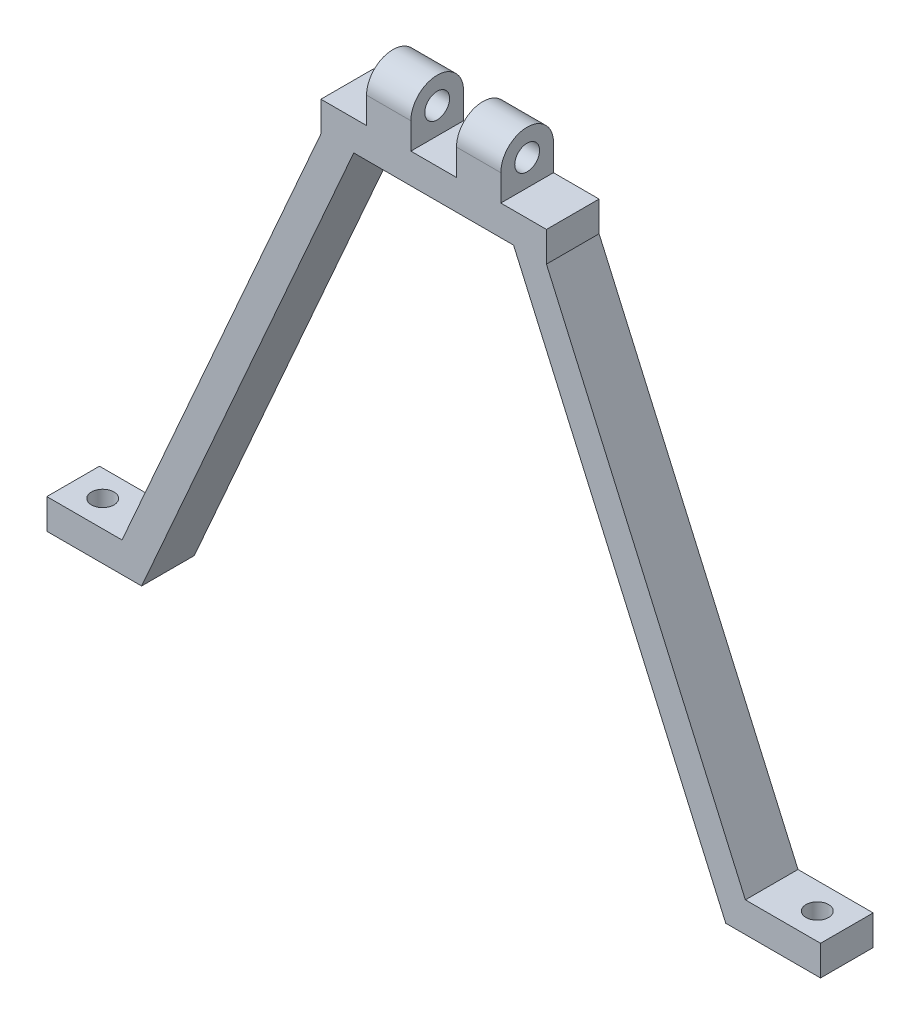
ISO-10303-21;
HEADER;
FILE_DESCRIPTION(('STEP AP214'),'2;1');
FILE_NAME('part.step','',(''),(''),'','','');
FILE_SCHEMA(('AUTOMOTIVE_DESIGN { 1 0 10303 214 1 1 1 1 }'));
ENDSEC;
DATA;
#1=APPLICATION_CONTEXT('core data for automotive mechanical design processes');
#2=APPLICATION_PROTOCOL_DEFINITION('international standard','automotive_design',2000,#1);
#3=PRODUCT_CONTEXT('',#1,'mechanical');
#4=PRODUCT('Part','Part','',(#3));
#5=PRODUCT_RELATED_PRODUCT_CATEGORY('part','',(#4));
#6=PRODUCT_DEFINITION_FORMATION('','',#4);
#7=PRODUCT_DEFINITION_CONTEXT('part definition',#1,'design');
#8=PRODUCT_DEFINITION('design','',#6,#7);
#9=PRODUCT_DEFINITION_SHAPE('','',#8);
#10=(LENGTH_UNIT() NAMED_UNIT(*) SI_UNIT(.MILLI.,.METRE.));
#11=(NAMED_UNIT(*) PLANE_ANGLE_UNIT() SI_UNIT($,.RADIAN.));
#12=(NAMED_UNIT(*) SI_UNIT($,.STERADIAN.) SOLID_ANGLE_UNIT());
#13=UNCERTAINTY_MEASURE_WITH_UNIT(LENGTH_MEASURE(1.E-05),#10,'distance_accuracy_value','');
#14=(GEOMETRIC_REPRESENTATION_CONTEXT(3) GLOBAL_UNCERTAINTY_ASSIGNED_CONTEXT((#13)) GLOBAL_UNIT_ASSIGNED_CONTEXT((#10,
#11,#12)) REPRESENTATION_CONTEXT('',''));
#15=CARTESIAN_POINT('',(0.,0.,0.));
#16=DIRECTION('',(0.,0.,1.));
#17=DIRECTION('',(1.,0.,0.));
#18=AXIS2_PLACEMENT_3D('',#15,#16,#17);
#19=CARTESIAN_POINT('',(0.,0.,7.));
#20=DIRECTION('',(0.,-1.,0.));
#21=DIRECTION('',(1.,0.,0.));
#22=AXIS2_PLACEMENT_3D('',#19,#20,#21);
#23=PLANE('',#22);
#24=DIRECTION('',(0.,0.,1.));
#25=VECTOR('',#24,1.);
#26=CARTESIAN_POINT('',(15.,0.,0.));
#27=LINE('',#26,#25);
#28=CARTESIAN_POINT('',(15.,0.,0.));
#29=VERTEX_POINT('',#28);
#30=CARTESIAN_POINT('',(15.,0.,7.));
#31=VERTEX_POINT('',#30);
#32=EDGE_CURVE('E388',#29,#31,#27,.T.);
#33=ORIENTED_EDGE('',*,*,#32,.F.);
#34=DIRECTION('',(-1.,0.,0.));
#35=VECTOR('',#34,1.);
#36=CARTESIAN_POINT('',(0.,0.,0.));
#37=LINE('',#36,#35);
#38=CARTESIAN_POINT('',(8.93,0.,0.));
#39=VERTEX_POINT('',#38);
#40=EDGE_CURVE('E212',#29,#39,#37,.T.);
#41=ORIENTED_EDGE('',*,*,#40,.T.);
#42=DIRECTION('',(0.,0.,1.));
#43=VECTOR('',#42,1.);
#44=CARTESIAN_POINT('',(8.93,0.,0.));
#45=LINE('',#44,#43);
#46=CARTESIAN_POINT('',(8.93,0.,7.));
#47=VERTEX_POINT('',#46);
#48=EDGE_CURVE('E375',#39,#47,#45,.T.);
#49=ORIENTED_EDGE('',*,*,#48,.T.);
#50=DIRECTION('',(-1.,0.,0.));
#51=VECTOR('',#50,1.);
#52=CARTESIAN_POINT('',(0.,0.,7.));
#53=LINE('',#52,#51);
#54=EDGE_CURVE('E306',#31,#47,#53,.T.);
#55=ORIENTED_EDGE('',*,*,#54,.F.);
#56=EDGE_LOOP('',(#33,#41,#49,#55));
#57=FACE_BOUND('',#56,.T.);
#58=ADVANCED_FACE('F41',(#57),#23,.F.);
#59=CARTESIAN_POINT('',(15.,3.50000000000002,3.5));
#60=DIRECTION('',(-1.,0.,0.));
#61=DIRECTION('',(0.,0.,1.));
#62=AXIS2_PLACEMENT_3D('',#59,#60,#61);
#63=CYLINDRICAL_SURFACE('',#62,3.5);
#64=DIRECTION('',(-1.,0.,0.));
#65=VECTOR('',#64,1.);
#66=CARTESIAN_POINT('',(15.,3.50000000000002,0.));
#67=LINE('',#66,#65);
#68=CARTESIAN_POINT('',(-3.035,3.50000000000002,0.));
#69=VERTEX_POINT('',#68);
#70=CARTESIAN_POINT('',(-8.93,3.50000000000002,0.));
#71=VERTEX_POINT('',#70);
#72=EDGE_CURVE('E267',#69,#71,#67,.T.);
#73=ORIENTED_EDGE('',*,*,#72,.T.);
#74=CARTESIAN_POINT('',(-8.93,3.50000000000002,3.5));
#75=DIRECTION('',(1.,0.,0.));
#76=DIRECTION('',(0.,0.,-1.));
#77=AXIS2_PLACEMENT_3D('',#74,#75,#76);
#78=CIRCLE('',#77,3.5);
#79=CARTESIAN_POINT('',(-8.93,3.50000000000002,7.));
#80=VERTEX_POINT('',#79);
#81=EDGE_CURVE('E270',#71,#80,#78,.T.);
#82=ORIENTED_EDGE('',*,*,#81,.T.);
#83=DIRECTION('',(-1.,0.,0.));
#84=VECTOR('',#83,1.);
#85=CARTESIAN_POINT('',(15.,3.50000000000002,7.));
#86=LINE('',#85,#84);
#87=CARTESIAN_POINT('',(-3.035,3.50000000000002,7.));
#88=VERTEX_POINT('',#87);
#89=EDGE_CURVE('E272',#88,#80,#86,.T.);
#90=ORIENTED_EDGE('',*,*,#89,.F.);
#91=CARTESIAN_POINT('',(-3.035,3.50000000000002,3.5));
#92=DIRECTION('',(-1.,0.,0.));
#93=DIRECTION('',(0.,0.,1.));
#94=AXIS2_PLACEMENT_3D('',#91,#92,#93);
#95=CIRCLE('',#94,3.5);
#96=EDGE_CURVE('E256',#88,#69,#95,.T.);
#97=ORIENTED_EDGE('',*,*,#96,.T.);
#98=EDGE_LOOP('',(#73,#82,#90,#97));
#99=FACE_BOUND('',#98,.T.);
#100=ADVANCED_FACE('F353',(#99),#63,.T.);
#101=CARTESIAN_POINT('',(-8.93,0.,0.));
#102=VERTEX_POINT('',#101);
#103=CARTESIAN_POINT('',(-15.,0.,0.));
#104=VERTEX_POINT('',#103);
#105=EDGE_CURVE('E217',#102,#104,#37,.T.);
#106=ORIENTED_EDGE('',*,*,#105,.T.);
#107=DIRECTION('',(0.,0.,1.));
#108=VECTOR('',#107,1.);
#109=CARTESIAN_POINT('',(-15.,0.,0.));
#110=LINE('',#109,#108);
#111=CARTESIAN_POINT('',(-15.,0.,7.));
#112=VERTEX_POINT('',#111);
#113=EDGE_CURVE('E59',#104,#112,#110,.T.);
#114=ORIENTED_EDGE('',*,*,#113,.T.);
#115=CARTESIAN_POINT('',(-8.93,0.,7.));
#116=VERTEX_POINT('',#115);
#117=EDGE_CURVE('E307',#116,#112,#53,.T.);
#118=ORIENTED_EDGE('',*,*,#117,.F.);
#119=DIRECTION('',(0.,0.,1.));
#120=VECTOR('',#119,1.);
#121=CARTESIAN_POINT('',(-8.93,0.,0.));
#122=LINE('',#121,#120);
#123=EDGE_CURVE('E252',#102,#116,#122,.T.);
#124=ORIENTED_EDGE('',*,*,#123,.F.);
#125=EDGE_LOOP('',(#106,#114,#118,#124));
#126=FACE_BOUND('',#125,.T.);
#127=ADVANCED_FACE('F340',(#126),#23,.F.);
#128=CARTESIAN_POINT('',(0.,-68.0000000000001,7.));
#129=DIRECTION('',(0.,1.,0.));
#130=DIRECTION('',(-1.,0.,0.));
#131=AXIS2_PLACEMENT_3D('',#128,#129,#130);
#132=PLANE('',#131);
#133=CARTESIAN_POINT('',(-47.525,-68.,3.5));
#134=DIRECTION('',(0.,1.,0.));
#135=DIRECTION('',(-1.,0.,0.));
#136=AXIS2_PLACEMENT_3D('',#133,#134,#135);
#137=CIRCLE('',#136,1.5);
#138=CARTESIAN_POINT('',(-49.025,-68.,3.5));
#139=VERTEX_POINT('',#138);
#140=EDGE_CURVE('E247',#139,#139,#137,.T.);
#141=ORIENTED_EDGE('',*,*,#140,.T.);
#142=EDGE_LOOP('',(#141));
#143=FACE_BOUND('',#142,.T.);
#144=DIRECTION('',(1.,0.,0.));
#145=VECTOR('',#144,1.);
#146=CARTESIAN_POINT('',(0.,-68.0000000000001,0.));
#147=LINE('',#146,#145);
#148=CARTESIAN_POINT('',(-51.455,-68.,0.));
#149=VERTEX_POINT('',#148);
#150=CARTESIAN_POINT('',(-38.8471085793126,-68.,0.));
#151=VERTEX_POINT('',#150);
#152=EDGE_CURVE('E285',#149,#151,#147,.T.);
#153=ORIENTED_EDGE('',*,*,#152,.T.);
#154=DIRECTION('',(0.,0.,-1.));
#155=VECTOR('',#154,1.);
#156=CARTESIAN_POINT('',(-38.8471085793126,-68.,7.));
#157=LINE('',#156,#155);
#158=CARTESIAN_POINT('',(-38.8471085793126,-68.,7.));
#159=VERTEX_POINT('',#158);
#160=EDGE_CURVE('E11',#159,#151,#157,.T.);
#161=ORIENTED_EDGE('',*,*,#160,.F.);
#162=DIRECTION('',(1.,0.,0.));
#163=VECTOR('',#162,1.);
#164=CARTESIAN_POINT('',(0.,-68.0000000000001,7.));
#165=LINE('',#164,#163);
#166=CARTESIAN_POINT('',(-51.455,-68.,7.));
#167=VERTEX_POINT('',#166);
#168=EDGE_CURVE('E224',#167,#159,#165,.T.);
#169=ORIENTED_EDGE('',*,*,#168,.F.);
#170=DIRECTION('',(0.,0.,-1.));
#171=VECTOR('',#170,1.);
#172=CARTESIAN_POINT('',(-51.455,-68.,7.));
#173=LINE('',#172,#171);
#174=EDGE_CURVE('E221',#167,#149,#173,.T.);
#175=ORIENTED_EDGE('',*,*,#174,.T.);
#176=EDGE_LOOP('',(#153,#161,#169,#175));
#177=FACE_BOUND('',#176,.T.);
#178=ADVANCED_FACE('F43',(#143,#177),#132,.F.);
#179=CARTESIAN_POINT('',(-7.421901816958,3.2724402094604,7.));
#180=DIRECTION('',(-0.915005570112647,0.403441205955501,0.));
#181=DIRECTION('',(-0.403441205955501,-0.915005570112647,0.));
#182=AXIS2_PLACEMENT_3D('',#179,#180,#181);
#183=PLANE('',#182);
#184=DIRECTION('',(0.403441205955501,0.915005570112647,0.));
#185=VECTOR('',#184,1.);
#186=CARTESIAN_POINT('',(-7.421901816958,3.2724402094604,0.));
#187=LINE('',#186,#185);
#188=CARTESIAN_POINT('',(-10.6284419126459,-4.00000000000001,0.));
#189=VERTEX_POINT('',#188);
#190=EDGE_CURVE('E316',#151,#189,#187,.T.);
#191=ORIENTED_EDGE('',*,*,#190,.T.);
#192=DIRECTION('',(0.,0.,-1.));
#193=VECTOR('',#192,1.);
#194=CARTESIAN_POINT('',(-10.6284419126459,-4.00000000000001,7.));
#195=LINE('',#194,#193);
#196=CARTESIAN_POINT('',(-10.6284419126459,-4.00000000000001,7.));
#197=VERTEX_POINT('',#196);
#198=EDGE_CURVE('E49',#197,#189,#195,.T.);
#199=ORIENTED_EDGE('',*,*,#198,.F.);
#200=DIRECTION('',(0.403441205955501,0.915005570112647,0.));
#201=VECTOR('',#200,1.);
#202=CARTESIAN_POINT('',(-7.421901816958,3.2724402094604,7.));
#203=LINE('',#202,#201);
#204=EDGE_CURVE('E290',#159,#197,#203,.T.);
#205=ORIENTED_EDGE('',*,*,#204,.F.);
#206=ORIENTED_EDGE('',*,*,#160,.T.);
#207=EDGE_LOOP('',(#191,#199,#205,#206));
#208=FACE_BOUND('',#207,.T.);
#209=ADVANCED_FACE('F437',(#208),#183,.F.);
#210=CARTESIAN_POINT('',(0.,-4.00000000000001,7.));
#211=DIRECTION('',(0.,-1.,0.));
#212=DIRECTION('',(1.,0.,0.));
#213=AXIS2_PLACEMENT_3D('',#210,#211,#212);
#214=PLANE('',#213);
#215=DIRECTION('',(-1.,0.,0.));
#216=VECTOR('',#215,1.);
#217=CARTESIAN_POINT('',(0.,-4.00000000000001,0.));
#218=LINE('',#217,#216);
#219=CARTESIAN_POINT('',(10.6284419126459,-4.00000000000001,0.));
#220=VERTEX_POINT('',#219);
#221=EDGE_CURVE('E317',#220,#189,#218,.T.);
#222=ORIENTED_EDGE('',*,*,#221,.F.);
#223=DIRECTION('',(0.,0.,-1.));
#224=VECTOR('',#223,1.);
#225=CARTESIAN_POINT('',(10.6284419126459,-4.00000000000001,7.));
#226=LINE('',#225,#224);
#227=CARTESIAN_POINT('',(10.6284419126459,-4.00000000000001,7.));
#228=VERTEX_POINT('',#227);
#229=EDGE_CURVE('E243',#228,#220,#226,.T.);
#230=ORIENTED_EDGE('',*,*,#229,.F.);
#231=DIRECTION('',(-1.,0.,0.));
#232=VECTOR('',#231,1.);
#233=CARTESIAN_POINT('',(0.,-4.00000000000001,7.));
#234=LINE('',#233,#232);
#235=EDGE_CURVE('E288',#228,#197,#234,.T.);
#236=ORIENTED_EDGE('',*,*,#235,.T.);
#237=ORIENTED_EDGE('',*,*,#198,.T.);
#238=EDGE_LOOP('',(#222,#230,#236,#237));
#239=FACE_BOUND('',#238,.T.);
#240=ADVANCED_FACE('F443',(#239),#214,.T.);
#241=CARTESIAN_POINT('',(7.421901816958,3.2724402094604,7.));
#242=DIRECTION('',(-0.915005570112647,-0.403441205955501,0.));
#243=DIRECTION('',(0.403441205955501,-0.915005570112647,0.));
#244=AXIS2_PLACEMENT_3D('',#241,#242,#243);
#245=PLANE('',#244);
#246=DIRECTION('',(-0.403441205955501,0.915005570112647,0.));
#247=VECTOR('',#246,1.);
#248=CARTESIAN_POINT('',(7.421901816958,3.2724402094604,0.));
#249=LINE('',#248,#247);
#250=CARTESIAN_POINT('',(38.8471085793126,-68.,0.));
#251=VERTEX_POINT('',#250);
#252=EDGE_CURVE('E325',#251,#220,#249,.T.);
#253=ORIENTED_EDGE('',*,*,#252,.F.);
#254=DIRECTION('',(0.,0.,-1.));
#255=VECTOR('',#254,1.);
#256=CARTESIAN_POINT('',(38.8471085793126,-68.,7.));
#257=LINE('',#256,#255);
#258=CARTESIAN_POINT('',(38.8471085793126,-68.,7.));
#259=VERTEX_POINT('',#258);
#260=EDGE_CURVE('E239',#259,#251,#257,.T.);
#261=ORIENTED_EDGE('',*,*,#260,.F.);
#262=DIRECTION('',(-0.403441205955501,0.915005570112647,0.));
#263=VECTOR('',#262,1.);
#264=CARTESIAN_POINT('',(7.421901816958,3.2724402094604,7.));
#265=LINE('',#264,#263);
#266=EDGE_CURVE('E295',#259,#228,#265,.T.);
#267=ORIENTED_EDGE('',*,*,#266,.T.);
#268=ORIENTED_EDGE('',*,*,#229,.T.);
#269=EDGE_LOOP('',(#253,#261,#267,#268));
#270=FACE_BOUND('',#269,.T.);
#271=ADVANCED_FACE('F476',(#270),#245,.T.);
#272=CARTESIAN_POINT('',(0.,-68.0000000000001,7.));
#273=DIRECTION('',(0.,-1.,0.));
#274=DIRECTION('',(1.,0.,0.));
#275=AXIS2_PLACEMENT_3D('',#272,#273,#274);
#276=PLANE('',#275);
#277=CARTESIAN_POINT('',(47.525,-68.,3.49999999999999));
#278=DIRECTION('',(0.,1.,0.));
#279=DIRECTION('',(-1.,0.,0.));
#280=AXIS2_PLACEMENT_3D('',#277,#278,#279);
#281=CIRCLE('',#280,1.5);
#282=CARTESIAN_POINT('',(46.025,-68.,3.49999999999999));
#283=VERTEX_POINT('',#282);
#284=EDGE_CURVE('E276',#283,#283,#281,.T.);
#285=ORIENTED_EDGE('',*,*,#284,.T.);
#286=EDGE_LOOP('',(#285));
#287=FACE_BOUND('',#286,.T.);
#288=DIRECTION('',(-1.,0.,0.));
#289=VECTOR('',#288,1.);
#290=CARTESIAN_POINT('',(0.,-68.0000000000001,0.));
#291=LINE('',#290,#289);
#292=CARTESIAN_POINT('',(51.455,-68.,0.));
#293=VERTEX_POINT('',#292);
#294=EDGE_CURVE('E324',#293,#251,#291,.T.);
#295=ORIENTED_EDGE('',*,*,#294,.F.);
#296=DIRECTION('',(0.,0.,-1.));
#297=VECTOR('',#296,1.);
#298=CARTESIAN_POINT('',(51.455,-68.,7.));
#299=LINE('',#298,#297);
#300=CARTESIAN_POINT('',(51.455,-68.,7.));
#301=VERTEX_POINT('',#300);
#302=EDGE_CURVE('E240',#301,#293,#299,.T.);
#303=ORIENTED_EDGE('',*,*,#302,.F.);
#304=DIRECTION('',(-1.,0.,0.));
#305=VECTOR('',#304,1.);
#306=CARTESIAN_POINT('',(0.,-68.0000000000001,7.));
#307=LINE('',#306,#305);
#308=EDGE_CURVE('E293',#301,#259,#307,.T.);
#309=ORIENTED_EDGE('',*,*,#308,.T.);
#310=ORIENTED_EDGE('',*,*,#260,.T.);
#311=EDGE_LOOP('',(#295,#303,#309,#310));
#312=FACE_BOUND('',#311,.T.);
#313=ADVANCED_FACE('F483',(#287,#312),#276,.T.);
#314=CARTESIAN_POINT('',(51.4550000000001,0.,7.));
#315=DIRECTION('',(1.,0.,0.));
#316=DIRECTION('',(0.,1.,0.));
#317=AXIS2_PLACEMENT_3D('',#314,#315,#316);
#318=PLANE('',#317);
#319=DIRECTION('',(0.,-1.,0.));
#320=VECTOR('',#319,1.);
#321=CARTESIAN_POINT('',(51.4550000000001,0.,0.));
#322=LINE('',#321,#320);
#323=CARTESIAN_POINT('',(51.455,-64.,0.));
#324=VERTEX_POINT('',#323);
#325=EDGE_CURVE('E327',#324,#293,#322,.T.);
#326=ORIENTED_EDGE('',*,*,#325,.F.);
#327=DIRECTION('',(0.,0.,-1.));
#328=VECTOR('',#327,1.);
#329=CARTESIAN_POINT('',(51.455,-64.,7.));
#330=LINE('',#329,#328);
#331=CARTESIAN_POINT('',(51.455,-64.,7.));
#332=VERTEX_POINT('',#331);
#333=EDGE_CURVE('E234',#332,#324,#330,.T.);
#334=ORIENTED_EDGE('',*,*,#333,.F.);
#335=DIRECTION('',(0.,-1.,0.));
#336=VECTOR('',#335,1.);
#337=CARTESIAN_POINT('',(51.4550000000001,0.,7.));
#338=LINE('',#337,#336);
#339=EDGE_CURVE('E297',#332,#301,#338,.T.);
#340=ORIENTED_EDGE('',*,*,#339,.T.);
#341=ORIENTED_EDGE('',*,*,#302,.T.);
#342=EDGE_LOOP('',(#326,#334,#340,#341));
#343=FACE_BOUND('',#342,.T.);
#344=ADVANCED_FACE('F493',(#343),#318,.T.);
#345=CARTESIAN_POINT('',(0.,-64.,7.));
#346=DIRECTION('',(0.,1.,0.));
#347=DIRECTION('',(0.,0.,1.));
#348=AXIS2_PLACEMENT_3D('',#345,#346,#347);
#349=PLANE('',#348);
#350=CARTESIAN_POINT('',(47.525,-64.,3.49999999999999));
#351=DIRECTION('',(0.,1.,0.));
#352=DIRECTION('',(0.,0.,1.));
#353=AXIS2_PLACEMENT_3D('',#350,#351,#352);
#354=CIRCLE('',#353,1.5);
#355=CARTESIAN_POINT('',(47.525,-64.,4.99999999999999));
#356=VERTEX_POINT('',#355);
#357=EDGE_CURVE('E250',#356,#356,#354,.T.);
#358=ORIENTED_EDGE('',*,*,#357,.F.);
#359=EDGE_LOOP('',(#358));
#360=FACE_BOUND('',#359,.T.);
#361=DIRECTION('',(1.,0.,0.));
#362=VECTOR('',#361,1.);
#363=CARTESIAN_POINT('',(0.,-64.,0.));
#364=LINE('',#363,#362);
#365=CARTESIAN_POINT('',(41.455,-64.,0.));
#366=VERTEX_POINT('',#365);
#367=EDGE_CURVE('E332',#366,#324,#364,.T.);
#368=ORIENTED_EDGE('',*,*,#367,.F.);
#369=DIRECTION('',(0.,0.,-1.));
#370=VECTOR('',#369,1.);
#371=CARTESIAN_POINT('',(41.455,-64.,7.));
#372=LINE('',#371,#370);
#373=CARTESIAN_POINT('',(41.455,-64.,7.));
#374=VERTEX_POINT('',#373);
#375=EDGE_CURVE('E232',#374,#366,#372,.T.);
#376=ORIENTED_EDGE('',*,*,#375,.F.);
#377=DIRECTION('',(1.,0.,0.));
#378=VECTOR('',#377,1.);
#379=CARTESIAN_POINT('',(0.,-64.,7.));
#380=LINE('',#379,#378);
#381=EDGE_CURVE('E301',#374,#332,#380,.T.);
#382=ORIENTED_EDGE('',*,*,#381,.T.);
#383=ORIENTED_EDGE('',*,*,#333,.T.);
#384=EDGE_LOOP('',(#368,#376,#382,#383));
#385=FACE_BOUND('',#384,.T.);
#386=ADVANCED_FACE('F496',(#360,#385),#349,.T.);
#387=CARTESIAN_POINT('',(11.0819240974086,4.88620503328239,7.));
#388=DIRECTION('',(0.915005570112647,0.403441205955501,0.));
#389=DIRECTION('',(-0.403441205955501,0.915005570112647,0.));
#390=AXIS2_PLACEMENT_3D('',#387,#388,#389);
#391=PLANE('',#390);
#392=DIRECTION('',(0.403441205955501,-0.915005570112647,0.));
#393=VECTOR('',#392,1.);
#394=CARTESIAN_POINT('',(11.0819240974086,4.88620503328239,0.));
#395=LINE('',#394,#393);
#396=CARTESIAN_POINT('',(15.,-4.00000000000001,0.));
#397=VERTEX_POINT('',#396);
#398=EDGE_CURVE('E334',#397,#366,#395,.T.);
#399=ORIENTED_EDGE('',*,*,#398,.F.);
#400=DIRECTION('',(0.,0.,-1.));
#401=VECTOR('',#400,1.);
#402=CARTESIAN_POINT('',(15.,-4.00000000000001,7.));
#403=LINE('',#402,#401);
#404=CARTESIAN_POINT('',(15.,-4.00000000000001,7.));
#405=VERTEX_POINT('',#404);
#406=EDGE_CURVE('E210',#405,#397,#403,.T.);
#407=ORIENTED_EDGE('',*,*,#406,.F.);
#408=DIRECTION('',(0.403441205955501,-0.915005570112647,0.));
#409=VECTOR('',#408,1.);
#410=CARTESIAN_POINT('',(11.0819240974086,4.88620503328239,7.));
#411=LINE('',#410,#409);
#412=EDGE_CURVE('E303',#405,#374,#411,.T.);
#413=ORIENTED_EDGE('',*,*,#412,.T.);
#414=ORIENTED_EDGE('',*,*,#375,.T.);
#415=EDGE_LOOP('',(#399,#407,#413,#414));
#416=FACE_BOUND('',#415,.T.);
#417=ADVANCED_FACE('F475',(#416),#391,.T.);
#418=CARTESIAN_POINT('',(-11.0819240974086,4.88620503328239,7.));
#419=DIRECTION('',(0.915005570112647,-0.403441205955501,0.));
#420=DIRECTION('',(0.403441205955501,0.915005570112647,0.));
#421=AXIS2_PLACEMENT_3D('',#418,#419,#420);
#422=PLANE('',#421);
#423=DIRECTION('',(-0.403441205955501,-0.915005570112647,0.));
#424=VECTOR('',#423,1.);
#425=CARTESIAN_POINT('',(-11.0819240974086,4.88620503328239,0.));
#426=LINE('',#425,#424);
#427=CARTESIAN_POINT('',(-15.,-4.00000000000001,0.));
#428=VERTEX_POINT('',#427);
#429=CARTESIAN_POINT('',(-41.455,-64.,0.));
#430=VERTEX_POINT('',#429);
#431=EDGE_CURVE('E204',#428,#430,#426,.T.);
#432=ORIENTED_EDGE('',*,*,#431,.T.);
#433=DIRECTION('',(0.,0.,-1.));
#434=VECTOR('',#433,1.);
#435=CARTESIAN_POINT('',(-41.455,-64.,7.));
#436=LINE('',#435,#434);
#437=CARTESIAN_POINT('',(-41.455,-64.,7.));
#438=VERTEX_POINT('',#437);
#439=EDGE_CURVE('E208',#438,#430,#436,.T.);
#440=ORIENTED_EDGE('',*,*,#439,.F.);
#441=DIRECTION('',(-0.403441205955501,-0.915005570112647,0.));
#442=VECTOR('',#441,1.);
#443=CARTESIAN_POINT('',(-11.0819240974086,4.88620503328239,7.));
#444=LINE('',#443,#442);
#445=CARTESIAN_POINT('',(-15.,-4.00000000000001,7.));
#446=VERTEX_POINT('',#445);
#447=EDGE_CURVE('E206',#446,#438,#444,.T.);
#448=ORIENTED_EDGE('',*,*,#447,.F.);
#449=DIRECTION('',(0.,0.,-1.));
#450=VECTOR('',#449,1.);
#451=CARTESIAN_POINT('',(-15.,-4.00000000000001,7.));
#452=LINE('',#451,#450);
#453=EDGE_CURVE('E192',#446,#428,#452,.T.);
#454=ORIENTED_EDGE('',*,*,#453,.T.);
#455=EDGE_LOOP('',(#432,#440,#448,#454));
#456=FACE_BOUND('',#455,.T.);
#457=ADVANCED_FACE('F205',(#456),#422,.F.);
#458=CARTESIAN_POINT('',(0.,-64.,7.));
#459=DIRECTION('',(0.,-1.,0.));
#460=DIRECTION('',(0.,0.,-1.));
#461=AXIS2_PLACEMENT_3D('',#458,#459,#460);
#462=PLANE('',#461);
#463=CARTESIAN_POINT('',(-47.525,-64.,3.5));
#464=DIRECTION('',(0.,-1.,0.));
#465=DIRECTION('',(0.,0.,-1.));
#466=AXIS2_PLACEMENT_3D('',#463,#464,#465);
#467=CIRCLE('',#466,1.5);
#468=CARTESIAN_POINT('',(-47.525,-64.,2.));
#469=VERTEX_POINT('',#468);
#470=EDGE_CURVE('E245',#469,#469,#467,.T.);
#471=ORIENTED_EDGE('',*,*,#470,.T.);
#472=EDGE_LOOP('',(#471));
#473=FACE_BOUND('',#472,.T.);
#474=DIRECTION('',(-1.,0.,0.));
#475=VECTOR('',#474,1.);
#476=CARTESIAN_POINT('',(0.,-64.,0.));
#477=LINE('',#476,#475);
#478=CARTESIAN_POINT('',(-51.455,-64.,0.));
#479=VERTEX_POINT('',#478);
#480=EDGE_CURVE('E213',#430,#479,#477,.T.);
#481=ORIENTED_EDGE('',*,*,#480,.T.);
#482=DIRECTION('',(0.,0.,-1.));
#483=VECTOR('',#482,1.);
#484=CARTESIAN_POINT('',(-51.455,-64.,7.));
#485=LINE('',#484,#483);
#486=CARTESIAN_POINT('',(-51.455,-64.,7.));
#487=VERTEX_POINT('',#486);
#488=EDGE_CURVE('E229',#487,#479,#485,.T.);
#489=ORIENTED_EDGE('',*,*,#488,.F.);
#490=DIRECTION('',(-1.,0.,0.));
#491=VECTOR('',#490,1.);
#492=CARTESIAN_POINT('',(0.,-64.,7.));
#493=LINE('',#492,#491);
#494=EDGE_CURVE('E313',#438,#487,#493,.T.);
#495=ORIENTED_EDGE('',*,*,#494,.F.);
#496=ORIENTED_EDGE('',*,*,#439,.T.);
#497=EDGE_LOOP('',(#481,#489,#495,#496));
#498=FACE_BOUND('',#497,.T.);
#499=ADVANCED_FACE('F465',(#473,#498),#462,.F.);
#500=CARTESIAN_POINT('',(-51.4550000000001,0.,7.));
#501=DIRECTION('',(1.,0.,0.));
#502=DIRECTION('',(0.,1.,0.));
#503=AXIS2_PLACEMENT_3D('',#500,#501,#502);
#504=PLANE('',#503);
#505=DIRECTION('',(0.,-1.,0.));
#506=VECTOR('',#505,1.);
#507=CARTESIAN_POINT('',(-51.4550000000001,0.,0.));
#508=LINE('',#507,#506);
#509=EDGE_CURVE('E216',#479,#149,#508,.T.);
#510=ORIENTED_EDGE('',*,*,#509,.T.);
#511=ORIENTED_EDGE('',*,*,#174,.F.);
#512=DIRECTION('',(0.,-1.,0.));
#513=VECTOR('',#512,1.);
#514=CARTESIAN_POINT('',(-51.4550000000001,0.,7.));
#515=LINE('',#514,#513);
#516=EDGE_CURVE('E227',#487,#167,#515,.T.);
#517=ORIENTED_EDGE('',*,*,#516,.F.);
#518=ORIENTED_EDGE('',*,*,#488,.T.);
#519=EDGE_LOOP('',(#510,#511,#517,#518));
#520=FACE_BOUND('',#519,.T.);
#521=ADVANCED_FACE('F464',(#520),#504,.F.);
#522=CARTESIAN_POINT('',(0.,0.,7.));
#523=DIRECTION('',(0.,0.,1.));
#524=DIRECTION('',(1.,0.,0.));
#525=AXIS2_PLACEMENT_3D('',#522,#523,#524);
#526=PLANE('',#525);
#527=DIRECTION('',(0.,1.,0.));
#528=VECTOR('',#527,1.);
#529=CARTESIAN_POINT('',(-15.,-4.00000000000001,7.));
#530=LINE('',#529,#528);
#531=EDGE_CURVE('E196',#446,#112,#530,.T.);
#532=ORIENTED_EDGE('',*,*,#531,.F.);
#533=ORIENTED_EDGE('',*,*,#447,.T.);
#534=ORIENTED_EDGE('',*,*,#494,.T.);
#535=ORIENTED_EDGE('',*,*,#516,.T.);
#536=ORIENTED_EDGE('',*,*,#168,.T.);
#537=ORIENTED_EDGE('',*,*,#204,.T.);
#538=ORIENTED_EDGE('',*,*,#235,.F.);
#539=ORIENTED_EDGE('',*,*,#266,.F.);
#540=ORIENTED_EDGE('',*,*,#308,.F.);
#541=ORIENTED_EDGE('',*,*,#339,.F.);
#542=ORIENTED_EDGE('',*,*,#381,.F.);
#543=ORIENTED_EDGE('',*,*,#412,.F.);
#544=DIRECTION('',(0.,-1.,0.));
#545=VECTOR('',#544,1.);
#546=CARTESIAN_POINT('',(15.,-4.00000000000001,7.));
#547=LINE('',#546,#545);
#548=EDGE_CURVE('E391',#31,#405,#547,.T.);
#549=ORIENTED_EDGE('',*,*,#548,.F.);
#550=ORIENTED_EDGE('',*,*,#54,.T.);
#551=DIRECTION('',(0.,-1.,0.));
#552=VECTOR('',#551,1.);
#553=CARTESIAN_POINT('',(8.93,0.,7.));
#554=LINE('',#553,#552);
#555=CARTESIAN_POINT('',(8.93,3.50000000000002,7.));
#556=VERTEX_POINT('',#555);
#557=EDGE_CURVE('E376',#556,#47,#554,.T.);
#558=ORIENTED_EDGE('',*,*,#557,.F.);
#559=CARTESIAN_POINT('',(3.035,3.50000000000002,7.));
#560=VERTEX_POINT('',#559);
#561=EDGE_CURVE('E277',#556,#560,#86,.T.);
#562=ORIENTED_EDGE('',*,*,#561,.T.);
#563=DIRECTION('',(0.,1.,0.));
#564=VECTOR('',#563,1.);
#565=CARTESIAN_POINT('',(3.035,0.,7.));
#566=LINE('',#565,#564);
#567=CARTESIAN_POINT('',(3.035,0.,7.));
#568=VERTEX_POINT('',#567);
#569=EDGE_CURVE('E361',#568,#560,#566,.T.);
#570=ORIENTED_EDGE('',*,*,#569,.F.);
#571=DIRECTION('',(1.,0.,0.));
#572=VECTOR('',#571,1.);
#573=CARTESIAN_POINT('',(-3.035,0.,7.));
#574=LINE('',#573,#572);
#575=CARTESIAN_POINT('',(-3.035,0.,7.));
#576=VERTEX_POINT('',#575);
#577=EDGE_CURVE('E368',#576,#568,#574,.T.);
#578=ORIENTED_EDGE('',*,*,#577,.F.);
#579=DIRECTION('',(0.,-1.,0.));
#580=VECTOR('',#579,1.);
#581=CARTESIAN_POINT('',(-3.035,0.,7.));
#582=LINE('',#581,#580);
#583=EDGE_CURVE('E405',#88,#576,#582,.T.);
#584=ORIENTED_EDGE('',*,*,#583,.F.);
#585=ORIENTED_EDGE('',*,*,#89,.T.);
#586=DIRECTION('',(0.,1.,0.));
#587=VECTOR('',#586,1.);
#588=CARTESIAN_POINT('',(-8.93,0.,7.));
#589=LINE('',#588,#587);
#590=EDGE_CURVE('E346',#116,#80,#589,.T.);
#591=ORIENTED_EDGE('',*,*,#590,.F.);
#592=ORIENTED_EDGE('',*,*,#117,.T.);
#593=EDGE_LOOP('',(#532,#533,#534,#535,#536,#537,#538,#539,#540,#541,#542,#543,#549,#550,#558,
#562,#570,#578,#584,#585,#591,#592));
#594=FACE_BOUND('',#593,.T.);
#595=ADVANCED_FACE('F460',(#594),#526,.T.);
#596=CARTESIAN_POINT('',(0.,0.,0.));
#597=DIRECTION('',(0.,0.,1.));
#598=DIRECTION('',(1.,0.,0.));
#599=AXIS2_PLACEMENT_3D('',#596,#597,#598);
#600=PLANE('',#599);
#601=ORIENTED_EDGE('',*,*,#431,.F.);
#602=DIRECTION('',(0.,1.,0.));
#603=VECTOR('',#602,1.);
#604=CARTESIAN_POINT('',(-15.,-4.00000000000001,0.));
#605=LINE('',#604,#603);
#606=EDGE_CURVE('E186',#428,#104,#605,.T.);
#607=ORIENTED_EDGE('',*,*,#606,.T.);
#608=ORIENTED_EDGE('',*,*,#105,.F.);
#609=DIRECTION('',(0.,1.,0.));
#610=VECTOR('',#609,1.);
#611=CARTESIAN_POINT('',(-8.93,0.,0.));
#612=LINE('',#611,#610);
#613=EDGE_CURVE('E344',#102,#71,#612,.T.);
#614=ORIENTED_EDGE('',*,*,#613,.T.);
#615=ORIENTED_EDGE('',*,*,#72,.F.);
#616=DIRECTION('',(0.,-1.,0.));
#617=VECTOR('',#616,1.);
#618=CARTESIAN_POINT('',(-3.035,0.,0.));
#619=LINE('',#618,#617);
#620=CARTESIAN_POINT('',(-3.035,0.,0.));
#621=VERTEX_POINT('',#620);
#622=EDGE_CURVE('E360',#69,#621,#619,.T.);
#623=ORIENTED_EDGE('',*,*,#622,.T.);
#624=DIRECTION('',(1.,0.,0.));
#625=VECTOR('',#624,1.);
#626=CARTESIAN_POINT('',(-3.035,0.,0.));
#627=LINE('',#626,#625);
#628=CARTESIAN_POINT('',(3.035,0.,0.));
#629=VERTEX_POINT('',#628);
#630=EDGE_CURVE('E365',#621,#629,#627,.T.);
#631=ORIENTED_EDGE('',*,*,#630,.T.);
#632=DIRECTION('',(0.,1.,0.));
#633=VECTOR('',#632,1.);
#634=CARTESIAN_POINT('',(3.035,0.,0.));
#635=LINE('',#634,#633);
#636=CARTESIAN_POINT('',(3.035,3.50000000000002,0.));
#637=VERTEX_POINT('',#636);
#638=EDGE_CURVE('E366',#629,#637,#635,.T.);
#639=ORIENTED_EDGE('',*,*,#638,.T.);
#640=CARTESIAN_POINT('',(8.93,3.50000000000002,0.));
#641=VERTEX_POINT('',#640);
#642=EDGE_CURVE('E275',#641,#637,#67,.T.);
#643=ORIENTED_EDGE('',*,*,#642,.F.);
#644=DIRECTION('',(0.,-1.,0.));
#645=VECTOR('',#644,1.);
#646=CARTESIAN_POINT('',(8.93,0.,0.));
#647=LINE('',#646,#645);
#648=EDGE_CURVE('E374',#641,#39,#647,.T.);
#649=ORIENTED_EDGE('',*,*,#648,.T.);
#650=ORIENTED_EDGE('',*,*,#40,.F.);
#651=DIRECTION('',(0.,-1.,0.));
#652=VECTOR('',#651,1.);
#653=CARTESIAN_POINT('',(15.,-4.00000000000001,0.));
#654=LINE('',#653,#652);
#655=EDGE_CURVE('E392',#29,#397,#654,.T.);
#656=ORIENTED_EDGE('',*,*,#655,.T.);
#657=ORIENTED_EDGE('',*,*,#398,.T.);
#658=ORIENTED_EDGE('',*,*,#367,.T.);
#659=ORIENTED_EDGE('',*,*,#325,.T.);
#660=ORIENTED_EDGE('',*,*,#294,.T.);
#661=ORIENTED_EDGE('',*,*,#252,.T.);
#662=ORIENTED_EDGE('',*,*,#221,.T.);
#663=ORIENTED_EDGE('',*,*,#190,.F.);
#664=ORIENTED_EDGE('',*,*,#152,.F.);
#665=ORIENTED_EDGE('',*,*,#509,.F.);
#666=ORIENTED_EDGE('',*,*,#480,.F.);
#667=EDGE_LOOP('',(#601,#607,#608,#614,#615,#623,#631,#639,#643,#649,#650,#656,#657,#658,#659,
#660,#661,#662,#663,#664,#665,#666));
#668=FACE_BOUND('',#667,.T.);
#669=ADVANCED_FACE('F211',(#668),#600,.F.);
#670=CARTESIAN_POINT('',(-47.525,-68.,3.5));
#671=DIRECTION('',(0.,1.,0.));
#672=DIRECTION('',(-1.,0.,0.));
#673=AXIS2_PLACEMENT_3D('',#670,#671,#672);
#674=CYLINDRICAL_SURFACE('',#673,1.5);
#675=ORIENTED_EDGE('',*,*,#140,.F.);
#676=EDGE_LOOP('',(#675));
#677=FACE_BOUND('',#676,.T.);
#678=ORIENTED_EDGE('',*,*,#470,.F.);
#679=EDGE_LOOP('',(#678));
#680=FACE_BOUND('',#679,.T.);
#681=ADVANCED_FACE('F423',(#677,#680),#674,.F.);
#682=CARTESIAN_POINT('',(47.525,-68.,3.49999999999999));
#683=DIRECTION('',(0.,1.,0.));
#684=DIRECTION('',(-1.,0.,0.));
#685=AXIS2_PLACEMENT_3D('',#682,#683,#684);
#686=CYLINDRICAL_SURFACE('',#685,1.5);
#687=ORIENTED_EDGE('',*,*,#357,.T.);
#688=EDGE_LOOP('',(#687));
#689=FACE_BOUND('',#688,.T.);
#690=ORIENTED_EDGE('',*,*,#284,.F.);
#691=EDGE_LOOP('',(#690));
#692=FACE_BOUND('',#691,.T.);
#693=ADVANCED_FACE('F415',(#689,#692),#686,.F.);
#694=CARTESIAN_POINT('',(3.035,3.50000000000002,3.5));
#695=DIRECTION('',(1.,0.,0.));
#696=DIRECTION('',(0.,1.,0.));
#697=AXIS2_PLACEMENT_3D('',#694,#695,#696);
#698=CIRCLE('',#697,3.5);
#699=EDGE_CURVE('E254',#637,#560,#698,.T.);
#700=ORIENTED_EDGE('',*,*,#699,.T.);
#701=ORIENTED_EDGE('',*,*,#561,.F.);
#702=CARTESIAN_POINT('',(8.93,3.50000000000002,3.5));
#703=DIRECTION('',(-1.,0.,0.));
#704=DIRECTION('',(0.,0.,1.));
#705=AXIS2_PLACEMENT_3D('',#702,#703,#704);
#706=CIRCLE('',#705,3.5);
#707=EDGE_CURVE('E66',#556,#641,#706,.T.);
#708=ORIENTED_EDGE('',*,*,#707,.T.);
#709=ORIENTED_EDGE('',*,*,#642,.T.);
#710=EDGE_LOOP('',(#700,#701,#708,#709));
#711=FACE_BOUND('',#710,.T.);
#712=ADVANCED_FACE('F406',(#711),#63,.T.);
#713=CARTESIAN_POINT('',(8.93,0.,0.));
#714=DIRECTION('',(-1.,0.,0.));
#715=DIRECTION('',(0.,0.,1.));
#716=AXIS2_PLACEMENT_3D('',#713,#714,#715);
#717=PLANE('',#716);
#718=CARTESIAN_POINT('',(8.93,3.50000000000002,3.5));
#719=DIRECTION('',(-1.,0.,0.));
#720=DIRECTION('',(0.,0.,1.));
#721=AXIS2_PLACEMENT_3D('',#718,#719,#720);
#722=CIRCLE('',#721,1.65);
#723=CARTESIAN_POINT('',(8.93,3.50000000000002,5.15));
#724=VERTEX_POINT('',#723);
#725=EDGE_CURVE('E248',#724,#724,#722,.T.);
#726=ORIENTED_EDGE('',*,*,#725,.T.);
#727=EDGE_LOOP('',(#726));
#728=FACE_BOUND('',#727,.T.);
#729=ORIENTED_EDGE('',*,*,#557,.T.);
#730=ORIENTED_EDGE('',*,*,#48,.F.);
#731=ORIENTED_EDGE('',*,*,#648,.F.);
#732=ORIENTED_EDGE('',*,*,#707,.F.);
#733=EDGE_LOOP('',(#729,#730,#731,#732));
#734=FACE_BOUND('',#733,.T.);
#735=ADVANCED_FACE('F384',(#728,#734),#717,.F.);
#736=CARTESIAN_POINT('',(-3.035,0.,0.));
#737=DIRECTION('',(-1.,0.,0.));
#738=DIRECTION('',(0.,0.,1.));
#739=AXIS2_PLACEMENT_3D('',#736,#737,#738);
#740=PLANE('',#739);
#741=CARTESIAN_POINT('',(-3.035,3.50000000000002,3.5));
#742=DIRECTION('',(-1.,0.,0.));
#743=DIRECTION('',(0.,0.,1.));
#744=AXIS2_PLACEMENT_3D('',#741,#742,#743);
#745=CIRCLE('',#744,1.65);
#746=CARTESIAN_POINT('',(-3.035,3.50000000000002,5.15));
#747=VERTEX_POINT('',#746);
#748=EDGE_CURVE('E258',#747,#747,#745,.T.);
#749=ORIENTED_EDGE('',*,*,#748,.T.);
#750=EDGE_LOOP('',(#749));
#751=FACE_BOUND('',#750,.T.);
#752=ORIENTED_EDGE('',*,*,#583,.T.);
#753=DIRECTION('',(0.,0.,1.));
#754=VECTOR('',#753,1.);
#755=CARTESIAN_POINT('',(-3.035,0.,0.));
#756=LINE('',#755,#754);
#757=EDGE_CURVE('E359',#621,#576,#756,.T.);
#758=ORIENTED_EDGE('',*,*,#757,.F.);
#759=ORIENTED_EDGE('',*,*,#622,.F.);
#760=ORIENTED_EDGE('',*,*,#96,.F.);
#761=EDGE_LOOP('',(#752,#758,#759,#760));
#762=FACE_BOUND('',#761,.T.);
#763=ADVANCED_FACE('F357',(#751,#762),#740,.F.);
#764=CARTESIAN_POINT('',(3.035,0.,0.));
#765=DIRECTION('',(1.,0.,0.));
#766=DIRECTION('',(0.,1.,0.));
#767=AXIS2_PLACEMENT_3D('',#764,#765,#766);
#768=PLANE('',#767);
#769=CARTESIAN_POINT('',(3.035,3.50000000000002,3.5));
#770=DIRECTION('',(1.,0.,0.));
#771=DIRECTION('',(0.,1.,0.));
#772=AXIS2_PLACEMENT_3D('',#769,#770,#771);
#773=CIRCLE('',#772,1.65);
#774=CARTESIAN_POINT('',(3.035,5.15000000000002,3.5));
#775=VERTEX_POINT('',#774);
#776=EDGE_CURVE('E251',#775,#775,#773,.T.);
#777=ORIENTED_EDGE('',*,*,#776,.T.);
#778=EDGE_LOOP('',(#777));
#779=FACE_BOUND('',#778,.T.);
#780=ORIENTED_EDGE('',*,*,#699,.F.);
#781=ORIENTED_EDGE('',*,*,#638,.F.);
#782=DIRECTION('',(0.,0.,1.));
#783=VECTOR('',#782,1.);
#784=CARTESIAN_POINT('',(3.035,0.,0.));
#785=LINE('',#784,#783);
#786=EDGE_CURVE('E378',#629,#568,#785,.T.);
#787=ORIENTED_EDGE('',*,*,#786,.T.);
#788=ORIENTED_EDGE('',*,*,#569,.T.);
#789=EDGE_LOOP('',(#780,#781,#787,#788));
#790=FACE_BOUND('',#789,.T.);
#791=ADVANCED_FACE('F516',(#779,#790),#768,.F.);
#792=CARTESIAN_POINT('',(-3.035,0.,0.));
#793=DIRECTION('',(0.,-1.,0.));
#794=DIRECTION('',(1.,0.,0.));
#795=AXIS2_PLACEMENT_3D('',#792,#793,#794);
#796=PLANE('',#795);
#797=ORIENTED_EDGE('',*,*,#577,.T.);
#798=ORIENTED_EDGE('',*,*,#786,.F.);
#799=ORIENTED_EDGE('',*,*,#630,.F.);
#800=ORIENTED_EDGE('',*,*,#757,.T.);
#801=EDGE_LOOP('',(#797,#798,#799,#800));
#802=FACE_BOUND('',#801,.T.);
#803=ADVANCED_FACE('F521',(#802),#796,.F.);
#804=CARTESIAN_POINT('',(15.,3.50000000000002,3.5));
#805=DIRECTION('',(-1.,0.,0.));
#806=DIRECTION('',(0.,0.,1.));
#807=AXIS2_PLACEMENT_3D('',#804,#805,#806);
#808=CYLINDRICAL_SURFACE('',#807,1.65);
#809=CARTESIAN_POINT('',(-8.93,3.50000000000002,3.5));
#810=DIRECTION('',(1.,0.,0.));
#811=DIRECTION('',(0.,0.,-1.));
#812=AXIS2_PLACEMENT_3D('',#809,#810,#811);
#813=CIRCLE('',#812,1.65);
#814=CARTESIAN_POINT('',(-8.93,3.50000000000002,1.85));
#815=VERTEX_POINT('',#814);
#816=EDGE_CURVE('E44',#815,#815,#813,.T.);
#817=ORIENTED_EDGE('',*,*,#816,.F.);
#818=EDGE_LOOP('',(#817));
#819=FACE_BOUND('',#818,.T.);
#820=ORIENTED_EDGE('',*,*,#748,.F.);
#821=EDGE_LOOP('',(#820));
#822=FACE_BOUND('',#821,.T.);
#823=ADVANCED_FACE('F511',(#819,#822),#808,.F.);
#824=CARTESIAN_POINT('',(-8.93,0.,0.));
#825=DIRECTION('',(1.,0.,0.));
#826=DIRECTION('',(0.,0.,-1.));
#827=AXIS2_PLACEMENT_3D('',#824,#825,#826);
#828=PLANE('',#827);
#829=ORIENTED_EDGE('',*,*,#816,.T.);
#830=EDGE_LOOP('',(#829));
#831=FACE_BOUND('',#830,.T.);
#832=ORIENTED_EDGE('',*,*,#613,.F.);
#833=ORIENTED_EDGE('',*,*,#123,.T.);
#834=ORIENTED_EDGE('',*,*,#590,.T.);
#835=ORIENTED_EDGE('',*,*,#81,.F.);
#836=EDGE_LOOP('',(#832,#833,#834,#835));
#837=FACE_BOUND('',#836,.T.);
#838=ADVANCED_FACE('F512',(#831,#837),#828,.F.);
#839=ORIENTED_EDGE('',*,*,#776,.F.);
#840=EDGE_LOOP('',(#839));
#841=FACE_BOUND('',#840,.T.);
#842=ORIENTED_EDGE('',*,*,#725,.F.);
#843=EDGE_LOOP('',(#842));
#844=FACE_BOUND('',#843,.T.);
#845=ADVANCED_FACE('F505',(#841,#844),#808,.F.);
#846=CARTESIAN_POINT('',(15.,-4.00000000000001,0.));
#847=DIRECTION('',(-1.,0.,0.));
#848=DIRECTION('',(0.,0.,1.));
#849=AXIS2_PLACEMENT_3D('',#846,#847,#848);
#850=PLANE('',#849);
#851=ORIENTED_EDGE('',*,*,#548,.T.);
#852=ORIENTED_EDGE('',*,*,#406,.T.);
#853=ORIENTED_EDGE('',*,*,#655,.F.);
#854=ORIENTED_EDGE('',*,*,#32,.T.);
#855=EDGE_LOOP('',(#851,#852,#853,#854));
#856=FACE_BOUND('',#855,.T.);
#857=ADVANCED_FACE('F504',(#856),#850,.F.);
#858=CARTESIAN_POINT('',(-15.,-4.00000000000001,0.));
#859=DIRECTION('',(1.,0.,0.));
#860=DIRECTION('',(0.,0.,-1.));
#861=AXIS2_PLACEMENT_3D('',#858,#859,#860);
#862=PLANE('',#861);
#863=ORIENTED_EDGE('',*,*,#531,.T.);
#864=ORIENTED_EDGE('',*,*,#113,.F.);
#865=ORIENTED_EDGE('',*,*,#606,.F.);
#866=ORIENTED_EDGE('',*,*,#453,.F.);
#867=EDGE_LOOP('',(#863,#864,#865,#866));
#868=FACE_BOUND('',#867,.T.);
#869=ADVANCED_FACE('F195',(#868),#862,.F.);
#870=CLOSED_SHELL('',(#58,#100,#127,#178,#209,#240,#271,#313,#344,#386,#417,#457,#499,#521,#595,
#669,#681,#693,#712,#735,#763,#791,#803,#823,#838,#845,#857,#869));
#871=MANIFOLD_SOLID_BREP('B2',#870);
#872=ADVANCED_BREP_SHAPE_REPRESENTATION('',(#18,#871),#14);
#873=SHAPE_DEFINITION_REPRESENTATION(#9,#872);
ENDSEC;
END-ISO-10303-21;
